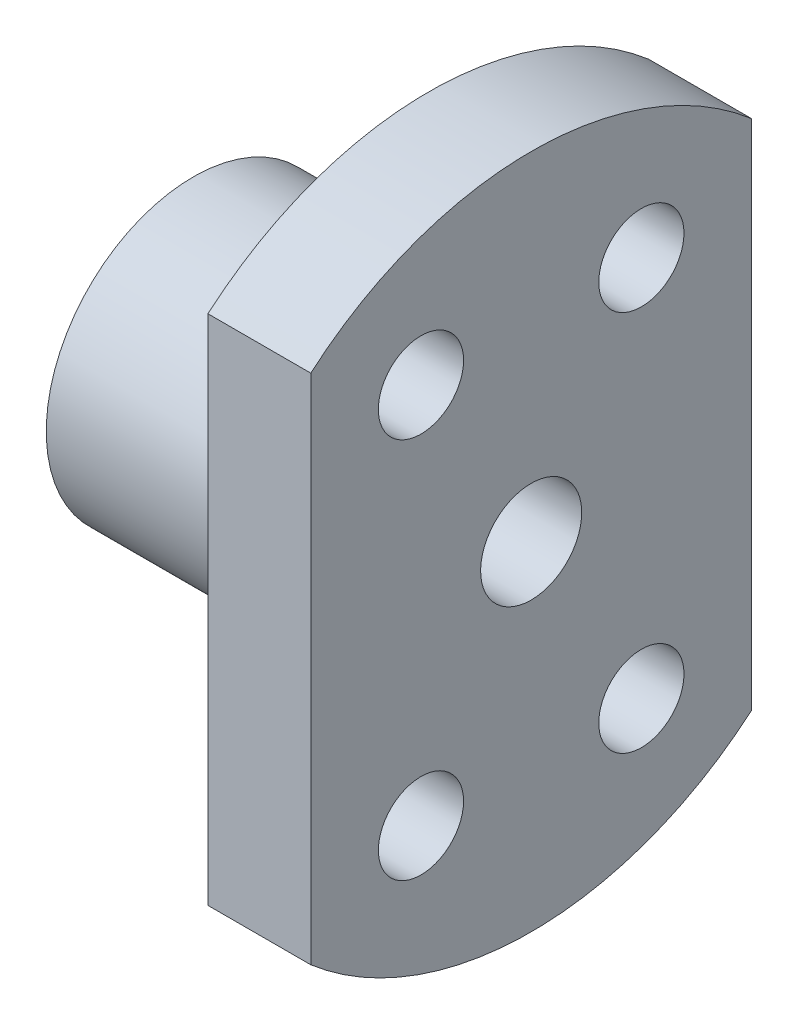
ISO-10303-21;
HEADER;
FILE_DESCRIPTION(('STEP AP214'),'2;1');
FILE_NAME('part.step','',(''),(''),'','','');
FILE_SCHEMA(('AUTOMOTIVE_DESIGN { 1 0 10303 214 1 1 1 1 }'));
ENDSEC;
DATA;
#1=APPLICATION_CONTEXT('core data for automotive mechanical design processes');
#2=APPLICATION_PROTOCOL_DEFINITION('international standard','automotive_design',2000,#1);
#3=PRODUCT_CONTEXT('',#1,'mechanical');
#4=PRODUCT('Part','Part','',(#3));
#5=PRODUCT_RELATED_PRODUCT_CATEGORY('part','',(#4));
#6=PRODUCT_DEFINITION_FORMATION('','',#4);
#7=PRODUCT_DEFINITION_CONTEXT('part definition',#1,'design');
#8=PRODUCT_DEFINITION('design','',#6,#7);
#9=PRODUCT_DEFINITION_SHAPE('','',#8);
#10=(LENGTH_UNIT() NAMED_UNIT(*) SI_UNIT(.MILLI.,.METRE.));
#11=(NAMED_UNIT(*) PLANE_ANGLE_UNIT() SI_UNIT($,.RADIAN.));
#12=(NAMED_UNIT(*) SI_UNIT($,.STERADIAN.) SOLID_ANGLE_UNIT());
#13=UNCERTAINTY_MEASURE_WITH_UNIT(LENGTH_MEASURE(1.E-05),#10,'distance_accuracy_value','');
#14=(GEOMETRIC_REPRESENTATION_CONTEXT(3) GLOBAL_UNCERTAINTY_ASSIGNED_CONTEXT((#13)) GLOBAL_UNIT_ASSIGNED_CONTEXT((#10,
#11,#12)) REPRESENTATION_CONTEXT('',''));
#15=CARTESIAN_POINT('',(0.,0.,0.));
#16=DIRECTION('',(0.,0.,1.));
#17=DIRECTION('',(1.,0.,0.));
#18=AXIS2_PLACEMENT_3D('',#15,#16,#17);
#19=CARTESIAN_POINT('',(2.25,5.,0.));
#20=DIRECTION('',(-1.,0.,0.));
#21=DIRECTION('',(0.,0.,1.));
#22=AXIS2_PLACEMENT_3D('',#19,#20,#21);
#23=PLANE('',#22);
#24=CARTESIAN_POINT('',(2.25,-6.49519052838331,-3.74999999999996));
#25=DIRECTION('',(-1.,0.,0.));
#26=DIRECTION('',(0.,0.,1.));
#27=AXIS2_PLACEMENT_3D('',#24,#25,#26);
#28=CIRCLE('',#27,1.45);
#29=CARTESIAN_POINT('',(2.25,-6.49519052838331,-2.29999999999996));
#30=VERTEX_POINT('',#29);
#31=EDGE_CURVE('E132',#30,#30,#28,.T.);
#32=ORIENTED_EDGE('',*,*,#31,.F.);
#33=EDGE_LOOP('',(#32));
#34=FACE_BOUND('',#33,.T.);
#35=CARTESIAN_POINT('',(2.25,-6.49519052838329,3.75000000000001));
#36=DIRECTION('',(-1.,0.,0.));
#37=DIRECTION('',(0.,0.,1.));
#38=AXIS2_PLACEMENT_3D('',#35,#36,#37);
#39=CIRCLE('',#38,1.45);
#40=CARTESIAN_POINT('',(2.25,-6.49519052838329,5.20000000000001));
#41=VERTEX_POINT('',#40);
#42=EDGE_CURVE('E140',#41,#41,#39,.T.);
#43=ORIENTED_EDGE('',*,*,#42,.F.);
#44=EDGE_LOOP('',(#43));
#45=FACE_BOUND('',#44,.T.);
#46=CARTESIAN_POINT('',(2.25,6.49519052838329,-3.75000000000001));
#47=DIRECTION('',(-1.,0.,0.));
#48=DIRECTION('',(0.,0.,1.));
#49=AXIS2_PLACEMENT_3D('',#46,#47,#48);
#50=CIRCLE('',#49,1.45);
#51=CARTESIAN_POINT('',(2.25,6.49519052838329,-2.30000000000001));
#52=VERTEX_POINT('',#51);
#53=EDGE_CURVE('E147',#52,#52,#50,.T.);
#54=ORIENTED_EDGE('',*,*,#53,.F.);
#55=EDGE_LOOP('',(#54));
#56=FACE_BOUND('',#55,.T.);
#57=CARTESIAN_POINT('',(2.25,6.49519052838331,3.74999999999996));
#58=DIRECTION('',(-1.,0.,0.));
#59=DIRECTION('',(0.,0.,1.));
#60=AXIS2_PLACEMENT_3D('',#57,#58,#59);
#61=CIRCLE('',#60,1.45);
#62=CARTESIAN_POINT('',(2.25,6.49519052838331,5.19999999999996));
#63=VERTEX_POINT('',#62);
#64=EDGE_CURVE('E155',#63,#63,#61,.T.);
#65=ORIENTED_EDGE('',*,*,#64,.F.);
#66=EDGE_LOOP('',(#65));
#67=FACE_BOUND('',#66,.T.);
#68=CARTESIAN_POINT('',(2.25,0.,0.));
#69=DIRECTION('',(1.,0.,0.));
#70=DIRECTION('',(0.,0.,-1.));
#71=AXIS2_PLACEMENT_3D('',#68,#69,#70);
#72=CIRCLE('',#71,5.);
#73=CARTESIAN_POINT('',(2.25,0.,-5.));
#74=VERTEX_POINT('',#73);
#75=EDGE_CURVE('E168',#74,#74,#72,.T.);
#76=ORIENTED_EDGE('',*,*,#75,.T.);
#77=EDGE_LOOP('',(#76));
#78=FACE_BOUND('',#77,.T.);
#79=CARTESIAN_POINT('',(2.25,0.,0.));
#80=DIRECTION('',(1.,0.,0.));
#81=DIRECTION('',(0.,0.,-1.));
#82=AXIS2_PLACEMENT_3D('',#79,#80,#81);
#83=CIRCLE('',#82,11.5);
#84=CARTESIAN_POINT('',(2.25,8.71779788708134,-7.5));
#85=VERTEX_POINT('',#84);
#86=CARTESIAN_POINT('',(2.25,8.71779788708134,7.5));
#87=VERTEX_POINT('',#86);
#88=EDGE_CURVE('E107',#85,#87,#83,.T.);
#89=ORIENTED_EDGE('',*,*,#88,.F.);
#90=DIRECTION('',(0.,-1.,0.));
#91=VECTOR('',#90,1.);
#92=CARTESIAN_POINT('',(2.25,5.,-7.5));
#93=LINE('',#92,#91);
#94=CARTESIAN_POINT('',(2.25,-8.71779788708135,-7.5));
#95=VERTEX_POINT('',#94);
#96=EDGE_CURVE('E122',#85,#95,#93,.T.);
#97=ORIENTED_EDGE('',*,*,#96,.T.);
#98=CARTESIAN_POINT('',(2.25,-8.71779788708135,7.5));
#99=VERTEX_POINT('',#98);
#100=EDGE_CURVE('E96',#99,#95,#83,.T.);
#101=ORIENTED_EDGE('',*,*,#100,.F.);
#102=DIRECTION('',(0.,1.,0.));
#103=VECTOR('',#102,1.);
#104=CARTESIAN_POINT('',(2.25,5.,7.5));
#105=LINE('',#104,#103);
#106=EDGE_CURVE('E109',#99,#87,#105,.T.);
#107=ORIENTED_EDGE('',*,*,#106,.T.);
#108=EDGE_LOOP('',(#89,#97,#101,#107));
#109=FACE_BOUND('',#108,.T.);
#110=ADVANCED_FACE('F48',(#34,#45,#56,#67,#78,#109),#23,.T.);
#111=CARTESIAN_POINT('',(5.75,0.,0.));
#112=DIRECTION('',(1.,0.,0.));
#113=DIRECTION('',(0.,0.,-1.));
#114=AXIS2_PLACEMENT_3D('',#111,#112,#113);
#115=CYLINDRICAL_SURFACE('',#114,11.5);
#116=ORIENTED_EDGE('',*,*,#100,.T.);
#117=DIRECTION('',(1.,0.,0.));
#118=VECTOR('',#117,1.);
#119=CARTESIAN_POINT('',(5.75,-8.71779788708135,-7.5));
#120=LINE('',#119,#118);
#121=CARTESIAN_POINT('',(5.75,-8.71779788708135,-7.5));
#122=VERTEX_POINT('',#121);
#123=EDGE_CURVE('E118',#95,#122,#120,.T.);
#124=ORIENTED_EDGE('',*,*,#123,.T.);
#125=CARTESIAN_POINT('',(5.75,0.,0.));
#126=DIRECTION('',(1.,0.,0.));
#127=DIRECTION('',(0.,0.,-1.));
#128=AXIS2_PLACEMENT_3D('',#125,#126,#127);
#129=CIRCLE('',#128,11.5);
#130=CARTESIAN_POINT('',(5.75,-8.71779788708135,7.5));
#131=VERTEX_POINT('',#130);
#132=EDGE_CURVE('E97',#131,#122,#129,.T.);
#133=ORIENTED_EDGE('',*,*,#132,.F.);
#134=DIRECTION('',(1.,0.,0.));
#135=VECTOR('',#134,1.);
#136=CARTESIAN_POINT('',(5.75,-8.71779788708135,7.5));
#137=LINE('',#136,#135);
#138=EDGE_CURVE('E64',#131,#99,#137,.F.);
#139=ORIENTED_EDGE('',*,*,#138,.T.);
#140=EDGE_LOOP('',(#116,#124,#133,#139));
#141=FACE_BOUND('',#140,.T.);
#142=ADVANCED_FACE('F189',(#141),#115,.T.);
#143=ORIENTED_EDGE('',*,*,#88,.T.);
#144=DIRECTION('',(1.,0.,0.));
#145=VECTOR('',#144,1.);
#146=CARTESIAN_POINT('',(5.75,8.71779788708134,7.5));
#147=LINE('',#146,#145);
#148=CARTESIAN_POINT('',(5.75,8.71779788708134,7.5));
#149=VERTEX_POINT('',#148);
#150=EDGE_CURVE('E101',#87,#149,#147,.T.);
#151=ORIENTED_EDGE('',*,*,#150,.T.);
#152=CARTESIAN_POINT('',(5.75,8.71779788708134,-7.5));
#153=VERTEX_POINT('',#152);
#154=EDGE_CURVE('E90',#153,#149,#129,.T.);
#155=ORIENTED_EDGE('',*,*,#154,.F.);
#156=DIRECTION('',(1.,0.,0.));
#157=VECTOR('',#156,1.);
#158=CARTESIAN_POINT('',(5.75,8.71779788708134,-7.5));
#159=LINE('',#158,#157);
#160=EDGE_CURVE('E72',#153,#85,#159,.F.);
#161=ORIENTED_EDGE('',*,*,#160,.T.);
#162=EDGE_LOOP('',(#143,#151,#155,#161));
#163=FACE_BOUND('',#162,.T.);
#164=ADVANCED_FACE('F105',(#163),#115,.T.);
#165=CARTESIAN_POINT('',(5.75,11.5,0.));
#166=DIRECTION('',(1.,0.,0.));
#167=DIRECTION('',(0.,0.,-1.));
#168=AXIS2_PLACEMENT_3D('',#165,#166,#167);
#169=PLANE('',#168);
#170=CARTESIAN_POINT('',(5.75,-6.49519052838331,-3.74999999999996));
#171=DIRECTION('',(1.,0.,0.));
#172=DIRECTION('',(0.,0.,-1.));
#173=AXIS2_PLACEMENT_3D('',#170,#171,#172);
#174=CIRCLE('',#173,1.45);
#175=CARTESIAN_POINT('',(5.75,-6.49519052838331,-5.19999999999996));
#176=VERTEX_POINT('',#175);
#177=EDGE_CURVE('E128',#176,#176,#174,.T.);
#178=ORIENTED_EDGE('',*,*,#177,.F.);
#179=EDGE_LOOP('',(#178));
#180=FACE_BOUND('',#179,.T.);
#181=CARTESIAN_POINT('',(5.75,-6.49519052838329,3.75000000000001));
#182=DIRECTION('',(1.,0.,0.));
#183=DIRECTION('',(0.,0.,-1.));
#184=AXIS2_PLACEMENT_3D('',#181,#182,#183);
#185=CIRCLE('',#184,1.45);
#186=CARTESIAN_POINT('',(5.75,-6.49519052838329,2.30000000000001));
#187=VERTEX_POINT('',#186);
#188=EDGE_CURVE('E136',#187,#187,#185,.T.);
#189=ORIENTED_EDGE('',*,*,#188,.F.);
#190=EDGE_LOOP('',(#189));
#191=FACE_BOUND('',#190,.T.);
#192=CARTESIAN_POINT('',(5.75,6.49519052838329,-3.75000000000001));
#193=DIRECTION('',(1.,0.,0.));
#194=DIRECTION('',(0.,0.,-1.));
#195=AXIS2_PLACEMENT_3D('',#192,#193,#194);
#196=CIRCLE('',#195,1.45);
#197=CARTESIAN_POINT('',(5.75,6.49519052838329,-5.20000000000001));
#198=VERTEX_POINT('',#197);
#199=EDGE_CURVE('E143',#198,#198,#196,.T.);
#200=ORIENTED_EDGE('',*,*,#199,.F.);
#201=EDGE_LOOP('',(#200));
#202=FACE_BOUND('',#201,.T.);
#203=CARTESIAN_POINT('',(5.75,6.49519052838331,3.74999999999996));
#204=DIRECTION('',(1.,0.,0.));
#205=DIRECTION('',(0.,0.,-1.));
#206=AXIS2_PLACEMENT_3D('',#203,#204,#205);
#207=CIRCLE('',#206,1.45);
#208=CARTESIAN_POINT('',(5.75,6.49519052838331,2.29999999999996));
#209=VERTEX_POINT('',#208);
#210=EDGE_CURVE('E151',#209,#209,#207,.T.);
#211=ORIENTED_EDGE('',*,*,#210,.F.);
#212=EDGE_LOOP('',(#211));
#213=FACE_BOUND('',#212,.T.);
#214=CARTESIAN_POINT('',(5.75,0.,0.));
#215=DIRECTION('',(-1.,0.,0.));
#216=DIRECTION('',(0.,-1.,0.));
#217=AXIS2_PLACEMENT_3D('',#214,#215,#216);
#218=CIRCLE('',#217,1.72);
#219=CARTESIAN_POINT('',(5.75,-1.72,0.));
#220=VERTEX_POINT('',#219);
#221=EDGE_CURVE('E160',#220,#220,#218,.T.);
#222=ORIENTED_EDGE('',*,*,#221,.T.);
#223=EDGE_LOOP('',(#222));
#224=FACE_BOUND('',#223,.T.);
#225=ORIENTED_EDGE('',*,*,#132,.T.);
#226=DIRECTION('',(0.,1.,0.));
#227=VECTOR('',#226,1.);
#228=CARTESIAN_POINT('',(5.75,11.5,-7.5));
#229=LINE('',#228,#227);
#230=EDGE_CURVE('E12',#122,#153,#229,.T.);
#231=ORIENTED_EDGE('',*,*,#230,.T.);
#232=ORIENTED_EDGE('',*,*,#154,.T.);
#233=DIRECTION('',(0.,-1.,0.));
#234=VECTOR('',#233,1.);
#235=CARTESIAN_POINT('',(5.75,11.5,7.5));
#236=LINE('',#235,#234);
#237=EDGE_CURVE('E57',#149,#131,#236,.T.);
#238=ORIENTED_EDGE('',*,*,#237,.T.);
#239=EDGE_LOOP('',(#225,#231,#232,#238));
#240=FACE_BOUND('',#239,.T.);
#241=ADVANCED_FACE('F91',(#180,#191,#202,#213,#224,#240),#169,.T.);
#242=CARTESIAN_POINT('',(-5.75,0.,0.));
#243=DIRECTION('',(-1.,0.,0.));
#244=DIRECTION('',(0.,0.,1.));
#245=AXIS2_PLACEMENT_3D('',#242,#243,#244);
#246=PLANE('',#245);
#247=CARTESIAN_POINT('',(-5.75,0.,0.));
#248=DIRECTION('',(-1.,0.,0.));
#249=DIRECTION('',(0.,-1.,0.));
#250=AXIS2_PLACEMENT_3D('',#247,#248,#249);
#251=CIRCLE('',#250,1.72);
#252=CARTESIAN_POINT('',(-5.75,-1.72,0.));
#253=VERTEX_POINT('',#252);
#254=EDGE_CURVE('E159',#253,#253,#251,.T.);
#255=ORIENTED_EDGE('',*,*,#254,.F.);
#256=EDGE_LOOP('',(#255));
#257=FACE_BOUND('',#256,.T.);
#258=CARTESIAN_POINT('',(-5.75,0.,0.));
#259=DIRECTION('',(1.,0.,0.));
#260=DIRECTION('',(0.,0.,-1.));
#261=AXIS2_PLACEMENT_3D('',#258,#259,#260);
#262=CIRCLE('',#261,5.);
#263=CARTESIAN_POINT('',(-5.75,0.,-5.));
#264=VERTEX_POINT('',#263);
#265=EDGE_CURVE('E104',#264,#264,#262,.T.);
#266=ORIENTED_EDGE('',*,*,#265,.F.);
#267=EDGE_LOOP('',(#266));
#268=FACE_BOUND('',#267,.T.);
#269=ADVANCED_FACE('F50',(#257,#268),#246,.T.);
#270=CARTESIAN_POINT('',(5.75,0.,0.));
#271=DIRECTION('',(1.,0.,0.));
#272=DIRECTION('',(0.,0.,-1.));
#273=AXIS2_PLACEMENT_3D('',#270,#271,#272);
#274=CYLINDRICAL_SURFACE('',#273,5.);
#275=ORIENTED_EDGE('',*,*,#265,.T.);
#276=EDGE_LOOP('',(#275));
#277=FACE_BOUND('',#276,.T.);
#278=ORIENTED_EDGE('',*,*,#75,.F.);
#279=EDGE_LOOP('',(#278));
#280=FACE_BOUND('',#279,.T.);
#281=ADVANCED_FACE('F176',(#277,#280),#274,.T.);
#282=CARTESIAN_POINT('',(5.75,0.,0.));
#283=DIRECTION('',(-1.,0.,0.));
#284=DIRECTION('',(0.,-1.,0.));
#285=AXIS2_PLACEMENT_3D('',#282,#283,#284);
#286=CYLINDRICAL_SURFACE('',#285,1.72);
#287=ORIENTED_EDGE('',*,*,#221,.F.);
#288=EDGE_LOOP('',(#287));
#289=FACE_BOUND('',#288,.T.);
#290=ORIENTED_EDGE('',*,*,#254,.T.);
#291=EDGE_LOOP('',(#290));
#292=FACE_BOUND('',#291,.T.);
#293=ADVANCED_FACE('F184',(#289,#292),#286,.F.);
#294=CARTESIAN_POINT('',(-5.75,6.49519052838331,3.74999999999996));
#295=DIRECTION('',(1.,0.,0.));
#296=DIRECTION('',(0.,0.,-1.));
#297=AXIS2_PLACEMENT_3D('',#294,#295,#296);
#298=CYLINDRICAL_SURFACE('',#297,1.45);
#299=ORIENTED_EDGE('',*,*,#64,.T.);
#300=EDGE_LOOP('',(#299));
#301=FACE_BOUND('',#300,.T.);
#302=ORIENTED_EDGE('',*,*,#210,.T.);
#303=EDGE_LOOP('',(#302));
#304=FACE_BOUND('',#303,.T.);
#305=ADVANCED_FACE('F201',(#301,#304),#298,.F.);
#306=CARTESIAN_POINT('',(-5.75,6.49519052838329,-3.75000000000001));
#307=DIRECTION('',(1.,0.,0.));
#308=DIRECTION('',(0.,0.,-1.));
#309=AXIS2_PLACEMENT_3D('',#306,#307,#308);
#310=CYLINDRICAL_SURFACE('',#309,1.45);
#311=ORIENTED_EDGE('',*,*,#53,.T.);
#312=EDGE_LOOP('',(#311));
#313=FACE_BOUND('',#312,.T.);
#314=ORIENTED_EDGE('',*,*,#199,.T.);
#315=EDGE_LOOP('',(#314));
#316=FACE_BOUND('',#315,.T.);
#317=ADVANCED_FACE('F205',(#313,#316),#310,.F.);
#318=CARTESIAN_POINT('',(-5.75,-6.49519052838329,3.75000000000001));
#319=DIRECTION('',(1.,0.,0.));
#320=DIRECTION('',(0.,0.,-1.));
#321=AXIS2_PLACEMENT_3D('',#318,#319,#320);
#322=CYLINDRICAL_SURFACE('',#321,1.45);
#323=ORIENTED_EDGE('',*,*,#42,.T.);
#324=EDGE_LOOP('',(#323));
#325=FACE_BOUND('',#324,.T.);
#326=ORIENTED_EDGE('',*,*,#188,.T.);
#327=EDGE_LOOP('',(#326));
#328=FACE_BOUND('',#327,.T.);
#329=ADVANCED_FACE('F209',(#325,#328),#322,.F.);
#330=CARTESIAN_POINT('',(-5.75,-6.49519052838331,-3.74999999999996));
#331=DIRECTION('',(1.,0.,0.));
#332=DIRECTION('',(0.,0.,-1.));
#333=AXIS2_PLACEMENT_3D('',#330,#331,#332);
#334=CYLINDRICAL_SURFACE('',#333,1.45);
#335=ORIENTED_EDGE('',*,*,#31,.T.);
#336=EDGE_LOOP('',(#335));
#337=FACE_BOUND('',#336,.T.);
#338=ORIENTED_EDGE('',*,*,#177,.T.);
#339=EDGE_LOOP('',(#338));
#340=FACE_BOUND('',#339,.T.);
#341=ADVANCED_FACE('F213',(#337,#340),#334,.F.);
#342=CARTESIAN_POINT('',(-5.75,-11.5,7.5));
#343=DIRECTION('',(0.,0.,1.));
#344=DIRECTION('',(1.,0.,0.));
#345=AXIS2_PLACEMENT_3D('',#342,#343,#344);
#346=PLANE('',#345);
#347=ORIENTED_EDGE('',*,*,#237,.F.);
#348=ORIENTED_EDGE('',*,*,#150,.F.);
#349=ORIENTED_EDGE('',*,*,#106,.F.);
#350=ORIENTED_EDGE('',*,*,#138,.F.);
#351=EDGE_LOOP('',(#347,#348,#349,#350));
#352=FACE_BOUND('',#351,.T.);
#353=ADVANCED_FACE('F100',(#352),#346,.T.);
#354=CARTESIAN_POINT('',(-5.75,-11.5,-7.5));
#355=DIRECTION('',(0.,0.,-1.));
#356=DIRECTION('',(-1.,0.,0.));
#357=AXIS2_PLACEMENT_3D('',#354,#355,#356);
#358=PLANE('',#357);
#359=ORIENTED_EDGE('',*,*,#230,.F.);
#360=ORIENTED_EDGE('',*,*,#123,.F.);
#361=ORIENTED_EDGE('',*,*,#96,.F.);
#362=ORIENTED_EDGE('',*,*,#160,.F.);
#363=EDGE_LOOP('',(#359,#360,#361,#362));
#364=FACE_BOUND('',#363,.T.);
#365=ADVANCED_FACE('F218',(#364),#358,.T.);
#366=CLOSED_SHELL('',(#110,#142,#164,#241,#269,#281,#293,#305,#317,#329,#341,#353,#365));
#367=MANIFOLD_SOLID_BREP('B2',#366);
#368=ADVANCED_BREP_SHAPE_REPRESENTATION('',(#18,#367),#14);
#369=SHAPE_DEFINITION_REPRESENTATION(#9,#368);
ENDSEC;
END-ISO-10303-21;
